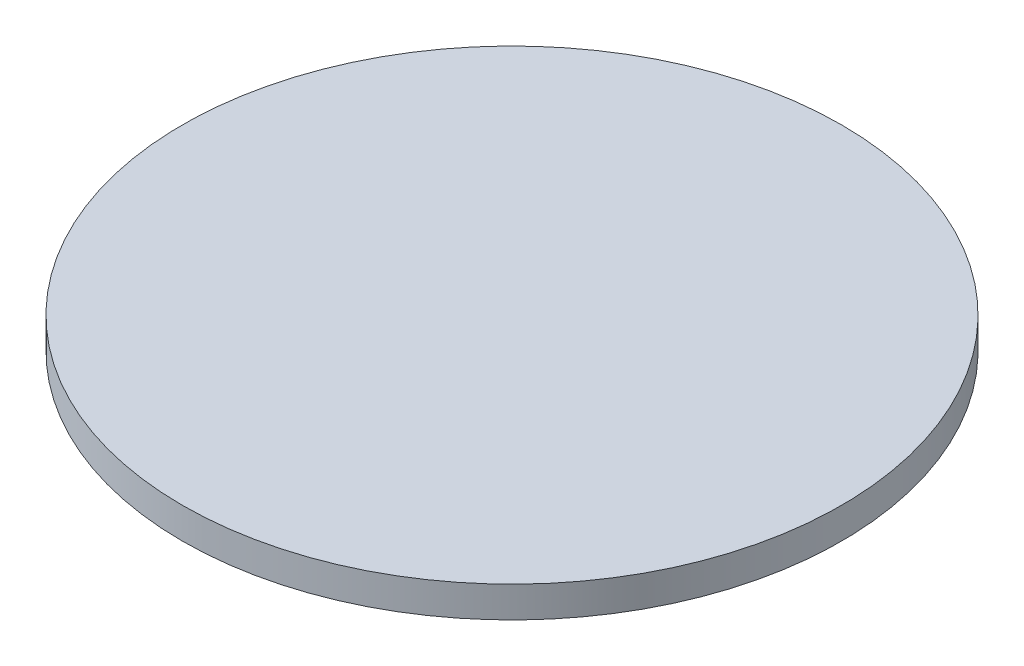
ISO-10303-21;
HEADER;
FILE_DESCRIPTION(('STEP AP214'),'2;1');
FILE_NAME('part.step','',(''),(''),'','','');
FILE_SCHEMA(('AUTOMOTIVE_DESIGN { 1 0 10303 214 1 1 1 1 }'));
ENDSEC;
DATA;
#1=APPLICATION_CONTEXT('core data for automotive mechanical design processes');
#2=APPLICATION_PROTOCOL_DEFINITION('international standard','automotive_design',2000,#1);
#3=PRODUCT_CONTEXT('',#1,'mechanical');
#4=PRODUCT('Part','Part','',(#3));
#5=PRODUCT_RELATED_PRODUCT_CATEGORY('part','',(#4));
#6=PRODUCT_DEFINITION_FORMATION('','',#4);
#7=PRODUCT_DEFINITION_CONTEXT('part definition',#1,'design');
#8=PRODUCT_DEFINITION('design','',#6,#7);
#9=PRODUCT_DEFINITION_SHAPE('','',#8);
#10=(LENGTH_UNIT() NAMED_UNIT(*) SI_UNIT(.MILLI.,.METRE.));
#11=(NAMED_UNIT(*) PLANE_ANGLE_UNIT() SI_UNIT($,.RADIAN.));
#12=(NAMED_UNIT(*) SI_UNIT($,.STERADIAN.) SOLID_ANGLE_UNIT());
#13=UNCERTAINTY_MEASURE_WITH_UNIT(LENGTH_MEASURE(1.E-05),#10,'distance_accuracy_value','');
#14=(GEOMETRIC_REPRESENTATION_CONTEXT(3) GLOBAL_UNCERTAINTY_ASSIGNED_CONTEXT((#13)) GLOBAL_UNIT_ASSIGNED_CONTEXT((#10,
#11,#12)) REPRESENTATION_CONTEXT('',''));
#15=CARTESIAN_POINT('',(0.,0.,0.));
#16=DIRECTION('',(0.,0.,1.));
#17=DIRECTION('',(1.,0.,0.));
#18=AXIS2_PLACEMENT_3D('',#15,#16,#17);
#19=CARTESIAN_POINT('',(0.,4.,0.));
#20=DIRECTION('',(0.,-1.,0.));
#21=DIRECTION('',(0.,0.,-1.));
#22=AXIS2_PLACEMENT_3D('',#19,#20,#21);
#23=CYLINDRICAL_SURFACE('',#22,42.5);
#24=CARTESIAN_POINT('',(0.,4.,0.));
#25=DIRECTION('',(0.,1.,0.));
#26=DIRECTION('',(0.,0.,1.));
#27=AXIS2_PLACEMENT_3D('',#24,#25,#26);
#28=CIRCLE('',#27,42.5);
#29=CARTESIAN_POINT('',(0.,4.,42.5));
#30=VERTEX_POINT('',#29);
#31=EDGE_CURVE('E10',#30,#30,#28,.T.);
#32=ORIENTED_EDGE('',*,*,#31,.F.);
#33=EDGE_LOOP('',(#32));
#34=FACE_BOUND('',#33,.T.);
#35=CARTESIAN_POINT('',(0.,0.,0.));
#36=DIRECTION('',(0.,1.,0.));
#37=DIRECTION('',(0.,0.,1.));
#38=AXIS2_PLACEMENT_3D('',#35,#36,#37);
#39=CIRCLE('',#38,42.5);
#40=CARTESIAN_POINT('',(0.,0.,42.5));
#41=VERTEX_POINT('',#40);
#42=EDGE_CURVE('E32',#41,#41,#39,.T.);
#43=ORIENTED_EDGE('',*,*,#42,.T.);
#44=EDGE_LOOP('',(#43));
#45=FACE_BOUND('',#44,.T.);
#46=ADVANCED_FACE('F29',(#34,#45),#23,.T.);
#47=CARTESIAN_POINT('',(0.,4.,0.));
#48=DIRECTION('',(0.,1.,0.));
#49=DIRECTION('',(0.,0.,1.));
#50=AXIS2_PLACEMENT_3D('',#47,#48,#49);
#51=PLANE('',#50);
#52=ORIENTED_EDGE('',*,*,#31,.T.);
#53=EDGE_LOOP('',(#52));
#54=FACE_BOUND('',#53,.T.);
#55=ADVANCED_FACE('F44',(#54),#51,.T.);
#56=CARTESIAN_POINT('',(0.,0.,0.));
#57=DIRECTION('',(0.,1.,0.));
#58=DIRECTION('',(0.,0.,1.));
#59=AXIS2_PLACEMENT_3D('',#56,#57,#58);
#60=PLANE('',#59);
#61=ORIENTED_EDGE('',*,*,#42,.F.);
#62=EDGE_LOOP('',(#61));
#63=FACE_BOUND('',#62,.T.);
#64=ADVANCED_FACE('F42',(#63),#60,.F.);
#65=CLOSED_SHELL('',(#46,#55,#64));
#66=MANIFOLD_SOLID_BREP('B2',#65);
#67=ADVANCED_BREP_SHAPE_REPRESENTATION('',(#18,#66),#14);
#68=SHAPE_DEFINITION_REPRESENTATION(#9,#67);
ENDSEC;
END-ISO-10303-21;
